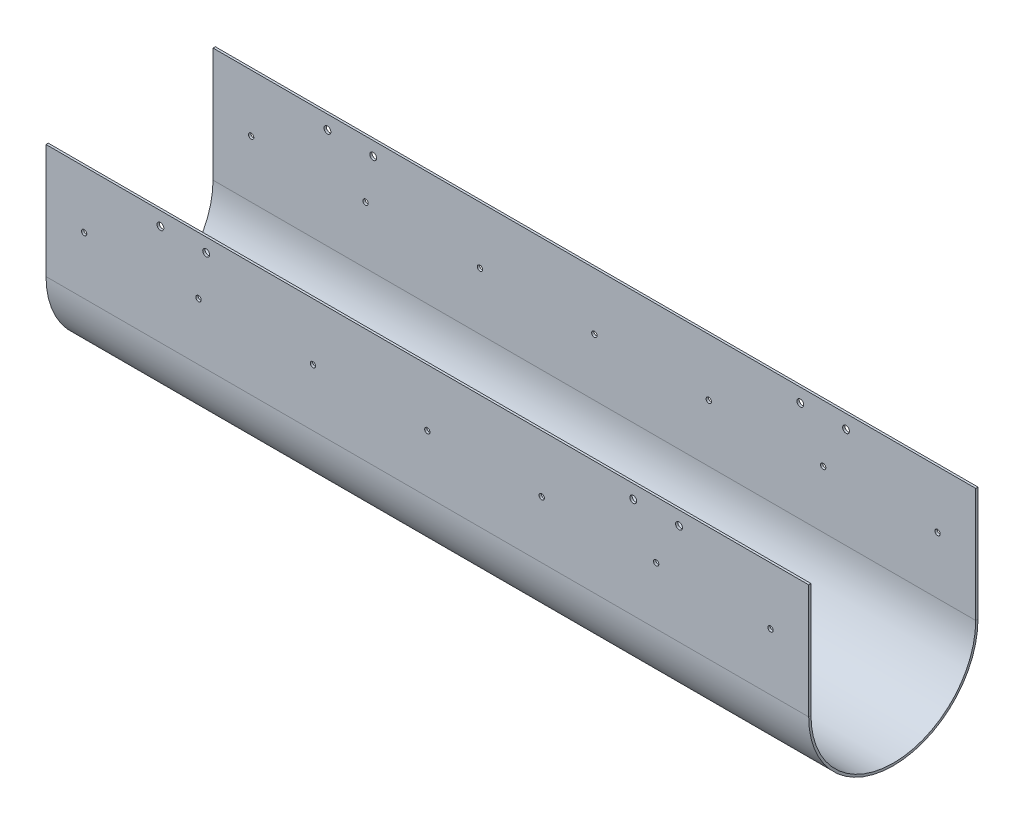
ISO-10303-21;
HEADER;
FILE_DESCRIPTION(('STEP AP214'),'2;1');
FILE_NAME('part.step','',(''),(''),'','','');
FILE_SCHEMA(('AUTOMOTIVE_DESIGN { 1 0 10303 214 1 1 1 1 }'));
ENDSEC;
DATA;
#1=APPLICATION_CONTEXT('core data for automotive mechanical design processes');
#2=APPLICATION_PROTOCOL_DEFINITION('international standard','automotive_design',2000,#1);
#3=PRODUCT_CONTEXT('',#1,'mechanical');
#4=PRODUCT('Part','Part','',(#3));
#5=PRODUCT_RELATED_PRODUCT_CATEGORY('part','',(#4));
#6=PRODUCT_DEFINITION_FORMATION('','',#4);
#7=PRODUCT_DEFINITION_CONTEXT('part definition',#1,'design');
#8=PRODUCT_DEFINITION('design','',#6,#7);
#9=PRODUCT_DEFINITION_SHAPE('','',#8);
#10=(LENGTH_UNIT() NAMED_UNIT(*) SI_UNIT(.MILLI.,.METRE.));
#11=(NAMED_UNIT(*) PLANE_ANGLE_UNIT() SI_UNIT($,.RADIAN.));
#12=(NAMED_UNIT(*) SI_UNIT($,.STERADIAN.) SOLID_ANGLE_UNIT());
#13=UNCERTAINTY_MEASURE_WITH_UNIT(LENGTH_MEASURE(1.E-05),#10,'distance_accuracy_value','');
#14=(GEOMETRIC_REPRESENTATION_CONTEXT(3) GLOBAL_UNCERTAINTY_ASSIGNED_CONTEXT((#13)) GLOBAL_UNIT_ASSIGNED_CONTEXT((#10,
#11,#12)) REPRESENTATION_CONTEXT('',''));
#15=CARTESIAN_POINT('',(0.,0.,0.));
#16=DIRECTION('',(0.,0.,1.));
#17=DIRECTION('',(1.,0.,0.));
#18=AXIS2_PLACEMENT_3D('',#15,#16,#17);
#19=CARTESIAN_POINT('',(500.,0.,108.));
#20=DIRECTION('',(-1.,0.,0.));
#21=DIRECTION('',(0.,1.,0.));
#22=AXIS2_PLACEMENT_3D('',#19,#20,#21);
#23=PLANE('',#22);
#24=DIRECTION('',(0.,0.,-1.));
#25=VECTOR('',#24,1.);
#26=CARTESIAN_POINT('',(500.,150.,108.));
#27=LINE('',#26,#25);
#28=CARTESIAN_POINT('',(500.,150.,111.));
#29=VERTEX_POINT('',#28);
#30=CARTESIAN_POINT('',(500.,150.,108.));
#31=VERTEX_POINT('',#30);
#32=EDGE_CURVE('E12',#29,#31,#27,.T.);
#33=ORIENTED_EDGE('',*,*,#32,.F.);
#34=DIRECTION('',(0.,1.,0.));
#35=VECTOR('',#34,1.);
#36=CARTESIAN_POINT('',(500.,0.,111.));
#37=LINE('',#36,#35);
#38=CARTESIAN_POINT('',(500.,0.,111.));
#39=VERTEX_POINT('',#38);
#40=EDGE_CURVE('E116',#39,#29,#37,.T.);
#41=ORIENTED_EDGE('',*,*,#40,.F.);
#42=DIRECTION('',(0.,0.,-1.));
#43=VECTOR('',#42,1.);
#44=CARTESIAN_POINT('',(500.,0.,108.));
#45=LINE('',#44,#43);
#46=CARTESIAN_POINT('',(500.,0.,108.));
#47=VERTEX_POINT('',#46);
#48=EDGE_CURVE('E56',#39,#47,#45,.T.);
#49=ORIENTED_EDGE('',*,*,#48,.T.);
#50=DIRECTION('',(0.,1.,0.));
#51=VECTOR('',#50,1.);
#52=CARTESIAN_POINT('',(500.,0.,108.));
#53=LINE('',#52,#51);
#54=EDGE_CURVE('E157',#47,#31,#53,.T.);
#55=ORIENTED_EDGE('',*,*,#54,.T.);
#56=EDGE_LOOP('',(#33,#41,#49,#55));
#57=FACE_BOUND('',#56,.T.);
#58=ADVANCED_FACE('F46',(#57),#23,.F.);
#59=CARTESIAN_POINT('',(500.,0.,0.));
#60=DIRECTION('',(-1.,0.,0.));
#61=DIRECTION('',(0.,0.,1.));
#62=AXIS2_PLACEMENT_3D('',#59,#60,#61);
#63=PLANE('',#62);
#64=ORIENTED_EDGE('',*,*,#48,.F.);
#65=CARTESIAN_POINT('',(500.,0.,0.));
#66=DIRECTION('',(1.,0.,0.));
#67=DIRECTION('',(0.,0.,-1.));
#68=AXIS2_PLACEMENT_3D('',#65,#66,#67);
#69=CIRCLE('',#68,111.);
#70=CARTESIAN_POINT('',(500.,0.,-111.));
#71=VERTEX_POINT('',#70);
#72=EDGE_CURVE('E132',#39,#71,#69,.T.);
#73=ORIENTED_EDGE('',*,*,#72,.T.);
#74=DIRECTION('',(0.,0.,1.));
#75=VECTOR('',#74,1.);
#76=CARTESIAN_POINT('',(500.,0.,-108.));
#77=LINE('',#76,#75);
#78=CARTESIAN_POINT('',(500.,0.,-108.));
#79=VERTEX_POINT('',#78);
#80=EDGE_CURVE('E151',#71,#79,#77,.T.);
#81=ORIENTED_EDGE('',*,*,#80,.T.);
#82=CARTESIAN_POINT('',(500.,0.,0.));
#83=DIRECTION('',(1.,0.,0.));
#84=DIRECTION('',(0.,0.,-1.));
#85=AXIS2_PLACEMENT_3D('',#82,#83,#84);
#86=CIRCLE('',#85,108.);
#87=EDGE_CURVE('E169',#47,#79,#86,.T.);
#88=ORIENTED_EDGE('',*,*,#87,.F.);
#89=EDGE_LOOP('',(#64,#73,#81,#88));
#90=FACE_BOUND('',#89,.T.);
#91=ADVANCED_FACE('F170',(#90),#63,.F.);
#92=CARTESIAN_POINT('',(500.,150.,-108.));
#93=DIRECTION('',(-1.,0.,0.));
#94=DIRECTION('',(0.,-1.,0.));
#95=AXIS2_PLACEMENT_3D('',#92,#93,#94);
#96=PLANE('',#95);
#97=ORIENTED_EDGE('',*,*,#80,.F.);
#98=DIRECTION('',(0.,-1.,0.));
#99=VECTOR('',#98,1.);
#100=CARTESIAN_POINT('',(500.,0.,-111.));
#101=LINE('',#100,#99);
#102=CARTESIAN_POINT('',(500.,150.,-111.));
#103=VERTEX_POINT('',#102);
#104=EDGE_CURVE('E136',#103,#71,#101,.T.);
#105=ORIENTED_EDGE('',*,*,#104,.F.);
#106=DIRECTION('',(0.,0.,1.));
#107=VECTOR('',#106,1.);
#108=CARTESIAN_POINT('',(500.,150.,-108.));
#109=LINE('',#108,#107);
#110=CARTESIAN_POINT('',(500.,150.,-108.));
#111=VERTEX_POINT('',#110);
#112=EDGE_CURVE('E149',#103,#111,#109,.T.);
#113=ORIENTED_EDGE('',*,*,#112,.T.);
#114=DIRECTION('',(0.,-1.,0.));
#115=VECTOR('',#114,1.);
#116=CARTESIAN_POINT('',(500.,150.,-108.));
#117=LINE('',#116,#115);
#118=EDGE_CURVE('E109',#111,#79,#117,.T.);
#119=ORIENTED_EDGE('',*,*,#118,.T.);
#120=EDGE_LOOP('',(#97,#105,#113,#119));
#121=FACE_BOUND('',#120,.T.);
#122=ADVANCED_FACE('F228',(#121),#96,.F.);
#123=CARTESIAN_POINT('',(500.,150.,-108.));
#124=DIRECTION('',(0.,1.,0.));
#125=DIRECTION('',(-1.,0.,0.));
#126=AXIS2_PLACEMENT_3D('',#123,#124,#125);
#127=PLANE('',#126);
#128=ORIENTED_EDGE('',*,*,#112,.F.);
#129=DIRECTION('',(1.,0.,0.));
#130=VECTOR('',#129,1.);
#131=CARTESIAN_POINT('',(0.,150.,-111.));
#132=LINE('',#131,#130);
#133=CARTESIAN_POINT('',(-500.,150.,-111.));
#134=VERTEX_POINT('',#133);
#135=EDGE_CURVE('E131',#103,#134,#132,.F.);
#136=ORIENTED_EDGE('',*,*,#135,.T.);
#137=DIRECTION('',(0.,0.,1.));
#138=VECTOR('',#137,1.);
#139=CARTESIAN_POINT('',(-500.,150.,-108.));
#140=LINE('',#139,#138);
#141=CARTESIAN_POINT('',(-500.,150.,-108.));
#142=VERTEX_POINT('',#141);
#143=EDGE_CURVE('E64',#134,#142,#140,.T.);
#144=ORIENTED_EDGE('',*,*,#143,.T.);
#145=DIRECTION('',(-1.,0.,0.));
#146=VECTOR('',#145,1.);
#147=CARTESIAN_POINT('',(500.,150.,-108.));
#148=LINE('',#147,#146);
#149=EDGE_CURVE('E186',#111,#142,#148,.T.);
#150=ORIENTED_EDGE('',*,*,#149,.F.);
#151=EDGE_LOOP('',(#128,#136,#144,#150));
#152=FACE_BOUND('',#151,.T.);
#153=ADVANCED_FACE('F233',(#152),#127,.T.);
#154=CARTESIAN_POINT('',(-500.,150.,-108.));
#155=DIRECTION('',(-1.,0.,0.));
#156=DIRECTION('',(0.,-1.,0.));
#157=AXIS2_PLACEMENT_3D('',#154,#155,#156);
#158=PLANE('',#157);
#159=ORIENTED_EDGE('',*,*,#143,.F.);
#160=DIRECTION('',(0.,-1.,0.));
#161=VECTOR('',#160,1.);
#162=CARTESIAN_POINT('',(-500.,0.,-111.));
#163=LINE('',#162,#161);
#164=CARTESIAN_POINT('',(-500.,0.,-111.));
#165=VERTEX_POINT('',#164);
#166=EDGE_CURVE('E133',#134,#165,#163,.T.);
#167=ORIENTED_EDGE('',*,*,#166,.T.);
#168=DIRECTION('',(0.,0.,1.));
#169=VECTOR('',#168,1.);
#170=CARTESIAN_POINT('',(-500.,0.,-108.));
#171=LINE('',#170,#169);
#172=CARTESIAN_POINT('',(-500.,0.,-108.));
#173=VERTEX_POINT('',#172);
#174=EDGE_CURVE('E145',#165,#173,#171,.T.);
#175=ORIENTED_EDGE('',*,*,#174,.T.);
#176=DIRECTION('',(0.,-1.,0.));
#177=VECTOR('',#176,1.);
#178=CARTESIAN_POINT('',(-500.,150.,-108.));
#179=LINE('',#178,#177);
#180=EDGE_CURVE('E189',#142,#173,#179,.T.);
#181=ORIENTED_EDGE('',*,*,#180,.F.);
#182=EDGE_LOOP('',(#159,#167,#175,#181));
#183=FACE_BOUND('',#182,.T.);
#184=ADVANCED_FACE('F198',(#183),#158,.T.);
#185=CARTESIAN_POINT('',(-500.,0.,0.));
#186=DIRECTION('',(-1.,0.,0.));
#187=DIRECTION('',(0.,0.,1.));
#188=AXIS2_PLACEMENT_3D('',#185,#186,#187);
#189=PLANE('',#188);
#190=ORIENTED_EDGE('',*,*,#174,.F.);
#191=CARTESIAN_POINT('',(-500.,0.,0.));
#192=DIRECTION('',(1.,0.,0.));
#193=DIRECTION('',(0.,0.,-1.));
#194=AXIS2_PLACEMENT_3D('',#191,#192,#193);
#195=CIRCLE('',#194,111.);
#196=CARTESIAN_POINT('',(-500.,0.,111.));
#197=VERTEX_POINT('',#196);
#198=EDGE_CURVE('E128',#197,#165,#195,.T.);
#199=ORIENTED_EDGE('',*,*,#198,.F.);
#200=DIRECTION('',(0.,0.,-1.));
#201=VECTOR('',#200,1.);
#202=CARTESIAN_POINT('',(-500.,0.,108.));
#203=LINE('',#202,#201);
#204=CARTESIAN_POINT('',(-500.,0.,108.));
#205=VERTEX_POINT('',#204);
#206=EDGE_CURVE('E108',#197,#205,#203,.T.);
#207=ORIENTED_EDGE('',*,*,#206,.T.);
#208=CARTESIAN_POINT('',(-500.,0.,0.));
#209=DIRECTION('',(1.,0.,0.));
#210=DIRECTION('',(0.,0.,-1.));
#211=AXIS2_PLACEMENT_3D('',#208,#209,#210);
#212=CIRCLE('',#211,108.);
#213=EDGE_CURVE('E175',#205,#173,#212,.T.);
#214=ORIENTED_EDGE('',*,*,#213,.T.);
#215=EDGE_LOOP('',(#190,#199,#207,#214));
#216=FACE_BOUND('',#215,.T.);
#217=ADVANCED_FACE('F202',(#216),#189,.T.);
#218=CARTESIAN_POINT('',(-500.,0.,108.));
#219=DIRECTION('',(-1.,0.,0.));
#220=DIRECTION('',(0.,1.,0.));
#221=AXIS2_PLACEMENT_3D('',#218,#219,#220);
#222=PLANE('',#221);
#223=ORIENTED_EDGE('',*,*,#206,.F.);
#224=DIRECTION('',(0.,1.,0.));
#225=VECTOR('',#224,1.);
#226=CARTESIAN_POINT('',(-500.,0.,111.));
#227=LINE('',#226,#225);
#228=CARTESIAN_POINT('',(-500.,150.,111.));
#229=VERTEX_POINT('',#228);
#230=EDGE_CURVE('E114',#197,#229,#227,.T.);
#231=ORIENTED_EDGE('',*,*,#230,.T.);
#232=DIRECTION('',(0.,0.,-1.));
#233=VECTOR('',#232,1.);
#234=CARTESIAN_POINT('',(-500.,150.,108.));
#235=LINE('',#234,#233);
#236=CARTESIAN_POINT('',(-500.,150.,108.));
#237=VERTEX_POINT('',#236);
#238=EDGE_CURVE('E50',#229,#237,#235,.T.);
#239=ORIENTED_EDGE('',*,*,#238,.T.);
#240=DIRECTION('',(0.,1.,0.));
#241=VECTOR('',#240,1.);
#242=CARTESIAN_POINT('',(-500.,0.,108.));
#243=LINE('',#242,#241);
#244=EDGE_CURVE('E180',#205,#237,#243,.T.);
#245=ORIENTED_EDGE('',*,*,#244,.F.);
#246=EDGE_LOOP('',(#223,#231,#239,#245));
#247=FACE_BOUND('',#246,.T.);
#248=ADVANCED_FACE('F118',(#247),#222,.T.);
#249=CARTESIAN_POINT('',(500.,150.,108.));
#250=DIRECTION('',(0.,-1.,0.));
#251=DIRECTION('',(-1.,0.,0.));
#252=AXIS2_PLACEMENT_3D('',#249,#250,#251);
#253=PLANE('',#252);
#254=DIRECTION('',(-1.,0.,0.));
#255=VECTOR('',#254,1.);
#256=CARTESIAN_POINT('',(0.,150.,111.));
#257=LINE('',#256,#255);
#258=EDGE_CURVE('E100',#29,#229,#257,.T.);
#259=ORIENTED_EDGE('',*,*,#258,.F.);
#260=ORIENTED_EDGE('',*,*,#32,.T.);
#261=DIRECTION('',(-1.,0.,0.));
#262=VECTOR('',#261,1.);
#263=CARTESIAN_POINT('',(500.,150.,108.));
#264=LINE('',#263,#262);
#265=EDGE_CURVE('E103',#31,#237,#264,.T.);
#266=ORIENTED_EDGE('',*,*,#265,.T.);
#267=ORIENTED_EDGE('',*,*,#238,.F.);
#268=EDGE_LOOP('',(#259,#260,#266,#267));
#269=FACE_BOUND('',#268,.T.);
#270=ADVANCED_FACE('F48',(#269),#253,.F.);
#271=CARTESIAN_POINT('',(0.,0.,108.));
#272=DIRECTION('',(0.,0.,-1.));
#273=DIRECTION('',(-1.,0.,0.));
#274=AXIS2_PLACEMENT_3D('',#271,#272,#273);
#275=PLANE('',#274);
#276=CARTESIAN_POINT('',(450.,74.9999999999999,108.));
#277=DIRECTION('',(0.,0.,-1.));
#278=DIRECTION('',(-1.,0.,0.));
#279=AXIS2_PLACEMENT_3D('',#276,#277,#278);
#280=CIRCLE('',#279,3.50000000000002);
#281=CARTESIAN_POINT('',(446.5,74.9999999999999,108.));
#282=VERTEX_POINT('',#281);
#283=EDGE_CURVE('E123',#282,#282,#280,.T.);
#284=ORIENTED_EDGE('',*,*,#283,.F.);
#285=EDGE_LOOP('',(#284));
#286=FACE_BOUND('',#285,.T.);
#287=CARTESIAN_POINT('',(-290.,132.,108.));
#288=DIRECTION('',(0.,0.,-1.));
#289=DIRECTION('',(-1.,0.,0.));
#290=AXIS2_PLACEMENT_3D('',#287,#288,#289);
#291=CIRCLE('',#290,4.50000000000002);
#292=CARTESIAN_POINT('',(-294.5,132.,108.));
#293=VERTEX_POINT('',#292);
#294=EDGE_CURVE('E351',#293,#293,#291,.T.);
#295=ORIENTED_EDGE('',*,*,#294,.F.);
#296=EDGE_LOOP('',(#295));
#297=FACE_BOUND('',#296,.T.);
#298=CARTESIAN_POINT('',(-350.,132.,108.));
#299=DIRECTION('',(0.,0.,-1.));
#300=DIRECTION('',(-1.,0.,0.));
#301=AXIS2_PLACEMENT_3D('',#298,#299,#300);
#302=CIRCLE('',#301,4.50000000000002);
#303=CARTESIAN_POINT('',(-354.5,132.,108.));
#304=VERTEX_POINT('',#303);
#305=EDGE_CURVE('E347',#304,#304,#302,.T.);
#306=ORIENTED_EDGE('',*,*,#305,.F.);
#307=EDGE_LOOP('',(#306));
#308=FACE_BOUND('',#307,.T.);
#309=CARTESIAN_POINT('',(330.,132.,108.));
#310=DIRECTION('',(0.,0.,-1.));
#311=DIRECTION('',(-1.,0.,0.));
#312=AXIS2_PLACEMENT_3D('',#309,#310,#311);
#313=CIRCLE('',#312,4.50000000000002);
#314=CARTESIAN_POINT('',(325.5,132.,108.));
#315=VERTEX_POINT('',#314);
#316=EDGE_CURVE('E343',#315,#315,#313,.T.);
#317=ORIENTED_EDGE('',*,*,#316,.F.);
#318=EDGE_LOOP('',(#317));
#319=FACE_BOUND('',#318,.T.);
#320=CARTESIAN_POINT('',(300.,74.9999999999999,108.));
#321=DIRECTION('',(0.,0.,-1.));
#322=DIRECTION('',(-1.,0.,0.));
#323=AXIS2_PLACEMENT_3D('',#320,#321,#322);
#324=CIRCLE('',#323,3.50000000000002);
#325=CARTESIAN_POINT('',(296.5,74.9999999999999,108.));
#326=VERTEX_POINT('',#325);
#327=EDGE_CURVE('E339',#326,#326,#324,.T.);
#328=ORIENTED_EDGE('',*,*,#327,.F.);
#329=EDGE_LOOP('',(#328));
#330=FACE_BOUND('',#329,.T.);
#331=CARTESIAN_POINT('',(150.,74.9999999999999,108.));
#332=DIRECTION('',(0.,0.,-1.));
#333=DIRECTION('',(-1.,0.,0.));
#334=AXIS2_PLACEMENT_3D('',#331,#332,#333);
#335=CIRCLE('',#334,3.49999999999999);
#336=CARTESIAN_POINT('',(146.5,74.9999999999999,108.));
#337=VERTEX_POINT('',#336);
#338=EDGE_CURVE('E335',#337,#337,#335,.T.);
#339=ORIENTED_EDGE('',*,*,#338,.F.);
#340=EDGE_LOOP('',(#339));
#341=FACE_BOUND('',#340,.T.);
#342=CARTESIAN_POINT('',(0.,74.9999999999999,108.));
#343=DIRECTION('',(0.,0.,-1.));
#344=DIRECTION('',(-1.,0.,0.));
#345=AXIS2_PLACEMENT_3D('',#342,#343,#344);
#346=CIRCLE('',#345,3.5);
#347=CARTESIAN_POINT('',(-3.49999999999995,74.9999999999999,108.));
#348=VERTEX_POINT('',#347);
#349=EDGE_CURVE('E331',#348,#348,#346,.T.);
#350=ORIENTED_EDGE('',*,*,#349,.F.);
#351=EDGE_LOOP('',(#350));
#352=FACE_BOUND('',#351,.T.);
#353=CARTESIAN_POINT('',(270.,132.,108.));
#354=DIRECTION('',(0.,0.,-1.));
#355=DIRECTION('',(-1.,0.,0.));
#356=AXIS2_PLACEMENT_3D('',#353,#354,#355);
#357=CIRCLE('',#356,4.50000000000002);
#358=CARTESIAN_POINT('',(265.5,132.,108.));
#359=VERTEX_POINT('',#358);
#360=EDGE_CURVE('E327',#359,#359,#357,.T.);
#361=ORIENTED_EDGE('',*,*,#360,.F.);
#362=EDGE_LOOP('',(#361));
#363=FACE_BOUND('',#362,.T.);
#364=CARTESIAN_POINT('',(-450.,74.9999999999998,108.));
#365=DIRECTION('',(0.,0.,-1.));
#366=DIRECTION('',(-1.,0.,0.));
#367=AXIS2_PLACEMENT_3D('',#364,#365,#366);
#368=CIRCLE('',#367,3.50000000000002);
#369=CARTESIAN_POINT('',(-453.5,74.9999999999998,108.));
#370=VERTEX_POINT('',#369);
#371=EDGE_CURVE('E323',#370,#370,#368,.T.);
#372=ORIENTED_EDGE('',*,*,#371,.F.);
#373=EDGE_LOOP('',(#372));
#374=FACE_BOUND('',#373,.T.);
#375=CARTESIAN_POINT('',(-300.,74.9999999999999,108.));
#376=DIRECTION('',(0.,0.,-1.));
#377=DIRECTION('',(-1.,0.,0.));
#378=AXIS2_PLACEMENT_3D('',#375,#376,#377);
#379=CIRCLE('',#378,3.50000000000002);
#380=CARTESIAN_POINT('',(-303.5,74.9999999999999,108.));
#381=VERTEX_POINT('',#380);
#382=EDGE_CURVE('E319',#381,#381,#379,.T.);
#383=ORIENTED_EDGE('',*,*,#382,.F.);
#384=EDGE_LOOP('',(#383));
#385=FACE_BOUND('',#384,.T.);
#386=CARTESIAN_POINT('',(-150.,74.9999999999999,108.));
#387=DIRECTION('',(0.,0.,-1.));
#388=DIRECTION('',(-1.,0.,0.));
#389=AXIS2_PLACEMENT_3D('',#386,#387,#388);
#390=CIRCLE('',#389,3.49999999999999);
#391=CARTESIAN_POINT('',(-153.5,74.9999999999999,108.));
#392=VERTEX_POINT('',#391);
#393=EDGE_CURVE('E306',#392,#392,#390,.T.);
#394=ORIENTED_EDGE('',*,*,#393,.F.);
#395=EDGE_LOOP('',(#394));
#396=FACE_BOUND('',#395,.T.);
#397=DIRECTION('',(-1.,0.,0.));
#398=VECTOR('',#397,1.);
#399=CARTESIAN_POINT('',(500.,0.,108.));
#400=LINE('',#399,#398);
#401=EDGE_CURVE('E140',#47,#205,#400,.T.);
#402=ORIENTED_EDGE('',*,*,#401,.T.);
#403=ORIENTED_EDGE('',*,*,#244,.T.);
#404=ORIENTED_EDGE('',*,*,#265,.F.);
#405=ORIENTED_EDGE('',*,*,#54,.F.);
#406=EDGE_LOOP('',(#402,#403,#404,#405));
#407=FACE_BOUND('',#406,.T.);
#408=ADVANCED_FACE('F163',(#286,#297,#308,#319,#330,#341,#352,#363,#374,#385,#396,#407),#275,.T.);
#409=CARTESIAN_POINT('',(500.,0.,0.));
#410=DIRECTION('',(1.,0.,0.));
#411=DIRECTION('',(0.,0.,-1.));
#412=AXIS2_PLACEMENT_3D('',#409,#410,#411);
#413=CYLINDRICAL_SURFACE('',#412,108.);
#414=DIRECTION('',(-1.,0.,0.));
#415=VECTOR('',#414,1.);
#416=CARTESIAN_POINT('',(500.,0.,-108.));
#417=LINE('',#416,#415);
#418=EDGE_CURVE('E166',#79,#173,#417,.T.);
#419=ORIENTED_EDGE('',*,*,#418,.T.);
#420=ORIENTED_EDGE('',*,*,#213,.F.);
#421=ORIENTED_EDGE('',*,*,#401,.F.);
#422=ORIENTED_EDGE('',*,*,#87,.T.);
#423=EDGE_LOOP('',(#419,#420,#421,#422));
#424=FACE_BOUND('',#423,.T.);
#425=ADVANCED_FACE('F178',(#424),#413,.F.);
#426=CARTESIAN_POINT('',(0.,0.,-108.));
#427=DIRECTION('',(0.,0.,1.));
#428=DIRECTION('',(0.,-1.,0.));
#429=AXIS2_PLACEMENT_3D('',#426,#427,#428);
#430=PLANE('',#429);
#431=CARTESIAN_POINT('',(450.,74.9999999999999,-108.));
#432=DIRECTION('',(0.,0.,1.));
#433=DIRECTION('',(0.,-1.,0.));
#434=AXIS2_PLACEMENT_3D('',#431,#432,#433);
#435=CIRCLE('',#434,3.50000000000002);
#436=CARTESIAN_POINT('',(450.,71.4999999999999,-108.));
#437=VERTEX_POINT('',#436);
#438=EDGE_CURVE('E265',#437,#437,#435,.T.);
#439=ORIENTED_EDGE('',*,*,#438,.F.);
#440=EDGE_LOOP('',(#439));
#441=FACE_BOUND('',#440,.T.);
#442=CARTESIAN_POINT('',(-290.,132.,-108.));
#443=DIRECTION('',(0.,0.,1.));
#444=DIRECTION('',(0.,-1.,0.));
#445=AXIS2_PLACEMENT_3D('',#442,#443,#444);
#446=CIRCLE('',#445,4.50000000000002);
#447=CARTESIAN_POINT('',(-290.,127.5,-108.));
#448=VERTEX_POINT('',#447);
#449=EDGE_CURVE('E269',#448,#448,#446,.T.);
#450=ORIENTED_EDGE('',*,*,#449,.F.);
#451=EDGE_LOOP('',(#450));
#452=FACE_BOUND('',#451,.T.);
#453=CARTESIAN_POINT('',(-350.,132.,-108.));
#454=DIRECTION('',(0.,0.,1.));
#455=DIRECTION('',(0.,-1.,0.));
#456=AXIS2_PLACEMENT_3D('',#453,#454,#455);
#457=CIRCLE('',#456,4.50000000000002);
#458=CARTESIAN_POINT('',(-350.,127.5,-108.));
#459=VERTEX_POINT('',#458);
#460=EDGE_CURVE('E273',#459,#459,#457,.T.);
#461=ORIENTED_EDGE('',*,*,#460,.F.);
#462=EDGE_LOOP('',(#461));
#463=FACE_BOUND('',#462,.T.);
#464=CARTESIAN_POINT('',(330.,132.,-108.));
#465=DIRECTION('',(0.,0.,1.));
#466=DIRECTION('',(0.,-1.,0.));
#467=AXIS2_PLACEMENT_3D('',#464,#465,#466);
#468=CIRCLE('',#467,4.50000000000002);
#469=CARTESIAN_POINT('',(330.,127.5,-108.));
#470=VERTEX_POINT('',#469);
#471=EDGE_CURVE('E277',#470,#470,#468,.T.);
#472=ORIENTED_EDGE('',*,*,#471,.F.);
#473=EDGE_LOOP('',(#472));
#474=FACE_BOUND('',#473,.T.);
#475=CARTESIAN_POINT('',(300.,74.9999999999999,-108.));
#476=DIRECTION('',(0.,0.,1.));
#477=DIRECTION('',(0.,-1.,0.));
#478=AXIS2_PLACEMENT_3D('',#475,#476,#477);
#479=CIRCLE('',#478,3.50000000000002);
#480=CARTESIAN_POINT('',(300.,71.4999999999999,-108.));
#481=VERTEX_POINT('',#480);
#482=EDGE_CURVE('E281',#481,#481,#479,.T.);
#483=ORIENTED_EDGE('',*,*,#482,.F.);
#484=EDGE_LOOP('',(#483));
#485=FACE_BOUND('',#484,.T.);
#486=CARTESIAN_POINT('',(150.,74.9999999999999,-108.));
#487=DIRECTION('',(0.,0.,1.));
#488=DIRECTION('',(0.,-1.,0.));
#489=AXIS2_PLACEMENT_3D('',#486,#487,#488);
#490=CIRCLE('',#489,3.49999999999999);
#491=CARTESIAN_POINT('',(150.,71.4999999999999,-108.));
#492=VERTEX_POINT('',#491);
#493=EDGE_CURVE('E285',#492,#492,#490,.T.);
#494=ORIENTED_EDGE('',*,*,#493,.F.);
#495=EDGE_LOOP('',(#494));
#496=FACE_BOUND('',#495,.T.);
#497=CARTESIAN_POINT('',(0.,74.9999999999999,-108.));
#498=DIRECTION('',(0.,0.,1.));
#499=DIRECTION('',(0.,-1.,0.));
#500=AXIS2_PLACEMENT_3D('',#497,#498,#499);
#501=CIRCLE('',#500,3.5);
#502=CARTESIAN_POINT('',(0.,71.4999999999999,-108.));
#503=VERTEX_POINT('',#502);
#504=EDGE_CURVE('E289',#503,#503,#501,.T.);
#505=ORIENTED_EDGE('',*,*,#504,.F.);
#506=EDGE_LOOP('',(#505));
#507=FACE_BOUND('',#506,.T.);
#508=CARTESIAN_POINT('',(270.,132.,-108.));
#509=DIRECTION('',(0.,0.,1.));
#510=DIRECTION('',(0.,-1.,0.));
#511=AXIS2_PLACEMENT_3D('',#508,#509,#510);
#512=CIRCLE('',#511,4.50000000000002);
#513=CARTESIAN_POINT('',(270.,127.5,-108.));
#514=VERTEX_POINT('',#513);
#515=EDGE_CURVE('E293',#514,#514,#512,.T.);
#516=ORIENTED_EDGE('',*,*,#515,.F.);
#517=EDGE_LOOP('',(#516));
#518=FACE_BOUND('',#517,.T.);
#519=CARTESIAN_POINT('',(-450.,74.9999999999998,-108.));
#520=DIRECTION('',(0.,0.,1.));
#521=DIRECTION('',(0.,-1.,0.));
#522=AXIS2_PLACEMENT_3D('',#519,#520,#521);
#523=CIRCLE('',#522,3.50000000000002);
#524=CARTESIAN_POINT('',(-450.,71.4999999999998,-108.));
#525=VERTEX_POINT('',#524);
#526=EDGE_CURVE('E297',#525,#525,#523,.T.);
#527=ORIENTED_EDGE('',*,*,#526,.F.);
#528=EDGE_LOOP('',(#527));
#529=FACE_BOUND('',#528,.T.);
#530=CARTESIAN_POINT('',(-300.,74.9999999999999,-108.));
#531=DIRECTION('',(0.,0.,1.));
#532=DIRECTION('',(0.,-1.,0.));
#533=AXIS2_PLACEMENT_3D('',#530,#531,#532);
#534=CIRCLE('',#533,3.50000000000002);
#535=CARTESIAN_POINT('',(-300.,71.4999999999998,-108.));
#536=VERTEX_POINT('',#535);
#537=EDGE_CURVE('E301',#536,#536,#534,.T.);
#538=ORIENTED_EDGE('',*,*,#537,.F.);
#539=EDGE_LOOP('',(#538));
#540=FACE_BOUND('',#539,.T.);
#541=CARTESIAN_POINT('',(-150.,74.9999999999999,-108.));
#542=DIRECTION('',(0.,0.,1.));
#543=DIRECTION('',(0.,-1.,0.));
#544=AXIS2_PLACEMENT_3D('',#541,#542,#543);
#545=CIRCLE('',#544,3.49999999999999);
#546=CARTESIAN_POINT('',(-150.,71.4999999999999,-108.));
#547=VERTEX_POINT('',#546);
#548=EDGE_CURVE('E304',#547,#547,#545,.T.);
#549=ORIENTED_EDGE('',*,*,#548,.F.);
#550=EDGE_LOOP('',(#549));
#551=FACE_BOUND('',#550,.T.);
#552=ORIENTED_EDGE('',*,*,#149,.T.);
#553=ORIENTED_EDGE('',*,*,#180,.T.);
#554=ORIENTED_EDGE('',*,*,#418,.F.);
#555=ORIENTED_EDGE('',*,*,#118,.F.);
#556=EDGE_LOOP('',(#552,#553,#554,#555));
#557=FACE_BOUND('',#556,.T.);
#558=ADVANCED_FACE('F195',(#441,#452,#463,#474,#485,#496,#507,#518,#529,#540,#551,#557),#430,.T.);
#559=CARTESIAN_POINT('',(0.,0.,111.));
#560=DIRECTION('',(0.,0.,-1.));
#561=DIRECTION('',(-1.,0.,0.));
#562=AXIS2_PLACEMENT_3D('',#559,#560,#561);
#563=PLANE('',#562);
#564=CARTESIAN_POINT('',(450.,74.9999999999999,111.));
#565=DIRECTION('',(0.,0.,1.));
#566=DIRECTION('',(1.,0.,0.));
#567=AXIS2_PLACEMENT_3D('',#564,#565,#566);
#568=CIRCLE('',#567,3.50000000000002);
#569=CARTESIAN_POINT('',(453.5,74.9999999999999,111.));
#570=VERTEX_POINT('',#569);
#571=EDGE_CURVE('E312',#570,#570,#568,.T.);
#572=ORIENTED_EDGE('',*,*,#571,.F.);
#573=EDGE_LOOP('',(#572));
#574=FACE_BOUND('',#573,.T.);
#575=CARTESIAN_POINT('',(-290.,132.,111.));
#576=DIRECTION('',(0.,0.,1.));
#577=DIRECTION('',(1.,0.,0.));
#578=AXIS2_PLACEMENT_3D('',#575,#576,#577);
#579=CIRCLE('',#578,4.50000000000002);
#580=CARTESIAN_POINT('',(-285.5,132.,111.));
#581=VERTEX_POINT('',#580);
#582=EDGE_CURVE('E375',#581,#581,#579,.T.);
#583=ORIENTED_EDGE('',*,*,#582,.F.);
#584=EDGE_LOOP('',(#583));
#585=FACE_BOUND('',#584,.T.);
#586=CARTESIAN_POINT('',(-350.,132.,111.));
#587=DIRECTION('',(0.,0.,1.));
#588=DIRECTION('',(1.,0.,0.));
#589=AXIS2_PLACEMENT_3D('',#586,#587,#588);
#590=CIRCLE('',#589,4.50000000000002);
#591=CARTESIAN_POINT('',(-345.5,132.,111.));
#592=VERTEX_POINT('',#591);
#593=EDGE_CURVE('E374',#592,#592,#590,.T.);
#594=ORIENTED_EDGE('',*,*,#593,.F.);
#595=EDGE_LOOP('',(#594));
#596=FACE_BOUND('',#595,.T.);
#597=CARTESIAN_POINT('',(330.,132.,111.));
#598=DIRECTION('',(0.,0.,1.));
#599=DIRECTION('',(1.,0.,0.));
#600=AXIS2_PLACEMENT_3D('',#597,#598,#599);
#601=CIRCLE('',#600,4.50000000000002);
#602=CARTESIAN_POINT('',(334.5,132.,111.));
#603=VERTEX_POINT('',#602);
#604=EDGE_CURVE('E365',#603,#603,#601,.T.);
#605=ORIENTED_EDGE('',*,*,#604,.F.);
#606=EDGE_LOOP('',(#605));
#607=FACE_BOUND('',#606,.T.);
#608=CARTESIAN_POINT('',(300.,74.9999999999999,111.));
#609=DIRECTION('',(0.,0.,1.));
#610=DIRECTION('',(1.,0.,0.));
#611=AXIS2_PLACEMENT_3D('',#608,#609,#610);
#612=CIRCLE('',#611,3.50000000000002);
#613=CARTESIAN_POINT('',(303.5,74.9999999999999,111.));
#614=VERTEX_POINT('',#613);
#615=EDGE_CURVE('E409',#614,#614,#612,.T.);
#616=ORIENTED_EDGE('',*,*,#615,.F.);
#617=EDGE_LOOP('',(#616));
#618=FACE_BOUND('',#617,.T.);
#619=CARTESIAN_POINT('',(150.,74.9999999999999,111.));
#620=DIRECTION('',(0.,0.,1.));
#621=DIRECTION('',(1.,0.,0.));
#622=AXIS2_PLACEMENT_3D('',#619,#620,#621);
#623=CIRCLE('',#622,3.49999999999999);
#624=CARTESIAN_POINT('',(153.5,74.9999999999999,111.));
#625=VERTEX_POINT('',#624);
#626=EDGE_CURVE('E414',#625,#625,#623,.T.);
#627=ORIENTED_EDGE('',*,*,#626,.F.);
#628=EDGE_LOOP('',(#627));
#629=FACE_BOUND('',#628,.T.);
#630=CARTESIAN_POINT('',(0.,74.9999999999999,111.));
#631=DIRECTION('',(0.,0.,1.));
#632=DIRECTION('',(1.,0.,0.));
#633=AXIS2_PLACEMENT_3D('',#630,#631,#632);
#634=CIRCLE('',#633,3.5);
#635=CARTESIAN_POINT('',(3.50000000000006,74.9999999999999,111.));
#636=VERTEX_POINT('',#635);
#637=EDGE_CURVE('E315',#636,#636,#634,.T.);
#638=ORIENTED_EDGE('',*,*,#637,.F.);
#639=EDGE_LOOP('',(#638));
#640=FACE_BOUND('',#639,.T.);
#641=CARTESIAN_POINT('',(270.,132.,111.));
#642=DIRECTION('',(0.,0.,1.));
#643=DIRECTION('',(1.,0.,0.));
#644=AXIS2_PLACEMENT_3D('',#641,#642,#643);
#645=CIRCLE('',#644,4.50000000000002);
#646=CARTESIAN_POINT('',(274.5,132.,111.));
#647=VERTEX_POINT('',#646);
#648=EDGE_CURVE('E388',#647,#647,#645,.T.);
#649=ORIENTED_EDGE('',*,*,#648,.F.);
#650=EDGE_LOOP('',(#649));
#651=FACE_BOUND('',#650,.T.);
#652=CARTESIAN_POINT('',(-450.,74.9999999999998,111.));
#653=DIRECTION('',(0.,0.,1.));
#654=DIRECTION('',(1.,0.,0.));
#655=AXIS2_PLACEMENT_3D('',#652,#653,#654);
#656=CIRCLE('',#655,3.50000000000002);
#657=CARTESIAN_POINT('',(-446.5,74.9999999999998,111.));
#658=VERTEX_POINT('',#657);
#659=EDGE_CURVE('E387',#658,#658,#656,.T.);
#660=ORIENTED_EDGE('',*,*,#659,.F.);
#661=EDGE_LOOP('',(#660));
#662=FACE_BOUND('',#661,.T.);
#663=CARTESIAN_POINT('',(-300.,74.9999999999999,111.));
#664=DIRECTION('',(0.,0.,1.));
#665=DIRECTION('',(1.,0.,0.));
#666=AXIS2_PLACEMENT_3D('',#663,#664,#665);
#667=CIRCLE('',#666,3.50000000000002);
#668=CARTESIAN_POINT('',(-296.5,74.9999999999999,111.));
#669=VERTEX_POINT('',#668);
#670=EDGE_CURVE('E400',#669,#669,#667,.T.);
#671=ORIENTED_EDGE('',*,*,#670,.F.);
#672=EDGE_LOOP('',(#671));
#673=FACE_BOUND('',#672,.T.);
#674=CARTESIAN_POINT('',(-150.,74.9999999999999,111.));
#675=DIRECTION('',(0.,0.,1.));
#676=DIRECTION('',(1.,0.,0.));
#677=AXIS2_PLACEMENT_3D('',#674,#675,#676);
#678=CIRCLE('',#677,3.49999999999999);
#679=CARTESIAN_POINT('',(-146.5,74.9999999999999,111.));
#680=VERTEX_POINT('',#679);
#681=EDGE_CURVE('E399',#680,#680,#678,.T.);
#682=ORIENTED_EDGE('',*,*,#681,.F.);
#683=EDGE_LOOP('',(#682));
#684=FACE_BOUND('',#683,.T.);
#685=DIRECTION('',(-1.,0.,0.));
#686=VECTOR('',#685,1.);
#687=CARTESIAN_POINT('',(0.,0.,111.));
#688=LINE('',#687,#686);
#689=EDGE_CURVE('E121',#39,#197,#688,.T.);
#690=ORIENTED_EDGE('',*,*,#689,.F.);
#691=ORIENTED_EDGE('',*,*,#40,.T.);
#692=ORIENTED_EDGE('',*,*,#258,.T.);
#693=ORIENTED_EDGE('',*,*,#230,.F.);
#694=EDGE_LOOP('',(#690,#691,#692,#693));
#695=FACE_BOUND('',#694,.T.);
#696=ADVANCED_FACE('F113',(#574,#585,#596,#607,#618,#629,#640,#651,#662,#673,#684,#695),#563,.F.);
#697=CARTESIAN_POINT('',(500.,0.,0.));
#698=DIRECTION('',(1.,0.,0.));
#699=DIRECTION('',(0.,0.,-1.));
#700=AXIS2_PLACEMENT_3D('',#697,#698,#699);
#701=CYLINDRICAL_SURFACE('',#700,111.);
#702=DIRECTION('',(1.,0.,0.));
#703=VECTOR('',#702,1.);
#704=CARTESIAN_POINT('',(500.,0.,-111.));
#705=LINE('',#704,#703);
#706=EDGE_CURVE('E127',#71,#165,#705,.F.);
#707=ORIENTED_EDGE('',*,*,#706,.F.);
#708=ORIENTED_EDGE('',*,*,#72,.F.);
#709=ORIENTED_EDGE('',*,*,#689,.T.);
#710=ORIENTED_EDGE('',*,*,#198,.T.);
#711=EDGE_LOOP('',(#707,#708,#709,#710));
#712=FACE_BOUND('',#711,.T.);
#713=ADVANCED_FACE('F210',(#712),#701,.T.);
#714=CARTESIAN_POINT('',(0.,0.,-111.));
#715=DIRECTION('',(0.,0.,1.));
#716=DIRECTION('',(0.,-1.,0.));
#717=AXIS2_PLACEMENT_3D('',#714,#715,#716);
#718=PLANE('',#717);
#719=CARTESIAN_POINT('',(450.,74.9999999999999,-111.));
#720=DIRECTION('',(0.,0.,1.));
#721=DIRECTION('',(1.,0.,0.));
#722=AXIS2_PLACEMENT_3D('',#719,#720,#721);
#723=CIRCLE('',#722,3.50000000000002);
#724=CARTESIAN_POINT('',(453.5,74.9999999999999,-111.));
#725=VERTEX_POINT('',#724);
#726=EDGE_CURVE('E307',#725,#725,#723,.T.);
#727=ORIENTED_EDGE('',*,*,#726,.T.);
#728=EDGE_LOOP('',(#727));
#729=FACE_BOUND('',#728,.T.);
#730=CARTESIAN_POINT('',(-290.,132.,-111.));
#731=DIRECTION('',(0.,0.,1.));
#732=DIRECTION('',(1.,0.,0.));
#733=AXIS2_PLACEMENT_3D('',#730,#731,#732);
#734=CIRCLE('',#733,4.50000000000002);
#735=CARTESIAN_POINT('',(-285.5,132.,-111.));
#736=VERTEX_POINT('',#735);
#737=EDGE_CURVE('E379',#736,#736,#734,.T.);
#738=ORIENTED_EDGE('',*,*,#737,.T.);
#739=EDGE_LOOP('',(#738));
#740=FACE_BOUND('',#739,.T.);
#741=CARTESIAN_POINT('',(-350.,132.,-111.));
#742=DIRECTION('',(0.,0.,1.));
#743=DIRECTION('',(1.,0.,0.));
#744=AXIS2_PLACEMENT_3D('',#741,#742,#743);
#745=CIRCLE('',#744,4.50000000000002);
#746=CARTESIAN_POINT('',(-345.5,132.,-111.));
#747=VERTEX_POINT('',#746);
#748=EDGE_CURVE('E371',#747,#747,#745,.T.);
#749=ORIENTED_EDGE('',*,*,#748,.T.);
#750=EDGE_LOOP('',(#749));
#751=FACE_BOUND('',#750,.T.);
#752=CARTESIAN_POINT('',(330.,132.,-111.));
#753=DIRECTION('',(0.,0.,1.));
#754=DIRECTION('',(1.,0.,0.));
#755=AXIS2_PLACEMENT_3D('',#752,#753,#754);
#756=CIRCLE('',#755,4.50000000000002);
#757=CARTESIAN_POINT('',(334.5,132.,-111.));
#758=VERTEX_POINT('',#757);
#759=EDGE_CURVE('E368',#758,#758,#756,.T.);
#760=ORIENTED_EDGE('',*,*,#759,.T.);
#761=EDGE_LOOP('',(#760));
#762=FACE_BOUND('',#761,.T.);
#763=CARTESIAN_POINT('',(300.,74.9999999999999,-111.));
#764=DIRECTION('',(0.,0.,1.));
#765=DIRECTION('',(1.,0.,0.));
#766=AXIS2_PLACEMENT_3D('',#763,#764,#765);
#767=CIRCLE('',#766,3.50000000000002);
#768=CARTESIAN_POINT('',(303.5,74.9999999999999,-111.));
#769=VERTEX_POINT('',#768);
#770=EDGE_CURVE('E411',#769,#769,#767,.T.);
#771=ORIENTED_EDGE('',*,*,#770,.T.);
#772=EDGE_LOOP('',(#771));
#773=FACE_BOUND('',#772,.T.);
#774=CARTESIAN_POINT('',(150.,74.9999999999999,-111.));
#775=DIRECTION('',(0.,0.,1.));
#776=DIRECTION('',(1.,0.,0.));
#777=AXIS2_PLACEMENT_3D('',#774,#775,#776);
#778=CIRCLE('',#777,3.49999999999999);
#779=CARTESIAN_POINT('',(153.5,74.9999999999999,-111.));
#780=VERTEX_POINT('',#779);
#781=EDGE_CURVE('E417',#780,#780,#778,.T.);
#782=ORIENTED_EDGE('',*,*,#781,.T.);
#783=EDGE_LOOP('',(#782));
#784=FACE_BOUND('',#783,.T.);
#785=CARTESIAN_POINT('',(0.,74.9999999999999,-111.));
#786=DIRECTION('',(0.,0.,1.));
#787=DIRECTION('',(1.,0.,0.));
#788=AXIS2_PLACEMENT_3D('',#785,#786,#787);
#789=CIRCLE('',#788,3.5);
#790=CARTESIAN_POINT('',(3.50000000000006,74.9999999999999,-111.));
#791=VERTEX_POINT('',#790);
#792=EDGE_CURVE('E403',#791,#791,#789,.T.);
#793=ORIENTED_EDGE('',*,*,#792,.T.);
#794=EDGE_LOOP('',(#793));
#795=FACE_BOUND('',#794,.T.);
#796=CARTESIAN_POINT('',(270.,132.,-111.));
#797=DIRECTION('',(0.,0.,1.));
#798=DIRECTION('',(1.,0.,0.));
#799=AXIS2_PLACEMENT_3D('',#796,#797,#798);
#800=CIRCLE('',#799,4.50000000000002);
#801=CARTESIAN_POINT('',(274.5,132.,-111.));
#802=VERTEX_POINT('',#801);
#803=EDGE_CURVE('E378',#802,#802,#800,.T.);
#804=ORIENTED_EDGE('',*,*,#803,.T.);
#805=EDGE_LOOP('',(#804));
#806=FACE_BOUND('',#805,.T.);
#807=CARTESIAN_POINT('',(-450.,74.9999999999998,-111.));
#808=DIRECTION('',(0.,0.,1.));
#809=DIRECTION('',(1.,0.,0.));
#810=AXIS2_PLACEMENT_3D('',#807,#808,#809);
#811=CIRCLE('',#810,3.50000000000002);
#812=CARTESIAN_POINT('',(-446.5,74.9999999999998,-111.));
#813=VERTEX_POINT('',#812);
#814=EDGE_CURVE('E384',#813,#813,#811,.T.);
#815=ORIENTED_EDGE('',*,*,#814,.T.);
#816=EDGE_LOOP('',(#815));
#817=FACE_BOUND('',#816,.T.);
#818=CARTESIAN_POINT('',(-300.,74.9999999999999,-111.));
#819=DIRECTION('',(0.,0.,1.));
#820=DIRECTION('',(1.,0.,0.));
#821=AXIS2_PLACEMENT_3D('',#818,#819,#820);
#822=CIRCLE('',#821,3.50000000000002);
#823=CARTESIAN_POINT('',(-296.5,74.9999999999999,-111.));
#824=VERTEX_POINT('',#823);
#825=EDGE_CURVE('E391',#824,#824,#822,.T.);
#826=ORIENTED_EDGE('',*,*,#825,.T.);
#827=EDGE_LOOP('',(#826));
#828=FACE_BOUND('',#827,.T.);
#829=CARTESIAN_POINT('',(-150.,74.9999999999999,-111.));
#830=DIRECTION('',(0.,0.,1.));
#831=DIRECTION('',(1.,0.,0.));
#832=AXIS2_PLACEMENT_3D('',#829,#830,#831);
#833=CIRCLE('',#832,3.49999999999999);
#834=CARTESIAN_POINT('',(-146.5,74.9999999999999,-111.));
#835=VERTEX_POINT('',#834);
#836=EDGE_CURVE('E396',#835,#835,#833,.T.);
#837=ORIENTED_EDGE('',*,*,#836,.T.);
#838=EDGE_LOOP('',(#837));
#839=FACE_BOUND('',#838,.T.);
#840=ORIENTED_EDGE('',*,*,#135,.F.);
#841=ORIENTED_EDGE('',*,*,#104,.T.);
#842=ORIENTED_EDGE('',*,*,#706,.T.);
#843=ORIENTED_EDGE('',*,*,#166,.F.);
#844=EDGE_LOOP('',(#840,#841,#842,#843));
#845=FACE_BOUND('',#844,.T.);
#846=ADVANCED_FACE('F206',(#729,#740,#751,#762,#773,#784,#795,#806,#817,#828,#839,#845),#718,.F.);
#847=CARTESIAN_POINT('',(-150.,74.9999999999999,-111.));
#848=DIRECTION('',(0.,0.,1.));
#849=DIRECTION('',(1.,0.,0.));
#850=AXIS2_PLACEMENT_3D('',#847,#848,#849);
#851=CYLINDRICAL_SURFACE('',#850,3.49999999999999);
#852=ORIENTED_EDGE('',*,*,#548,.T.);
#853=EDGE_LOOP('',(#852));
#854=FACE_BOUND('',#853,.T.);
#855=ORIENTED_EDGE('',*,*,#836,.F.);
#856=EDGE_LOOP('',(#855));
#857=FACE_BOUND('',#856,.T.);
#858=ADVANCED_FACE('F218',(#854,#857),#851,.F.);
#859=CARTESIAN_POINT('',(-300.,74.9999999999999,-111.));
#860=DIRECTION('',(0.,0.,1.));
#861=DIRECTION('',(1.,0.,0.));
#862=AXIS2_PLACEMENT_3D('',#859,#860,#861);
#863=CYLINDRICAL_SURFACE('',#862,3.50000000000002);
#864=ORIENTED_EDGE('',*,*,#537,.T.);
#865=EDGE_LOOP('',(#864));
#866=FACE_BOUND('',#865,.T.);
#867=ORIENTED_EDGE('',*,*,#825,.F.);
#868=EDGE_LOOP('',(#867));
#869=FACE_BOUND('',#868,.T.);
#870=ADVANCED_FACE('F450',(#866,#869),#863,.F.);
#871=CARTESIAN_POINT('',(-450.,74.9999999999998,-111.));
#872=DIRECTION('',(0.,0.,1.));
#873=DIRECTION('',(1.,0.,0.));
#874=AXIS2_PLACEMENT_3D('',#871,#872,#873);
#875=CYLINDRICAL_SURFACE('',#874,3.50000000000002);
#876=ORIENTED_EDGE('',*,*,#526,.T.);
#877=EDGE_LOOP('',(#876));
#878=FACE_BOUND('',#877,.T.);
#879=ORIENTED_EDGE('',*,*,#814,.F.);
#880=EDGE_LOOP('',(#879));
#881=FACE_BOUND('',#880,.T.);
#882=ADVANCED_FACE('F458',(#878,#881),#875,.F.);
#883=CARTESIAN_POINT('',(270.,132.,-111.));
#884=DIRECTION('',(0.,0.,1.));
#885=DIRECTION('',(1.,0.,0.));
#886=AXIS2_PLACEMENT_3D('',#883,#884,#885);
#887=CYLINDRICAL_SURFACE('',#886,4.50000000000002);
#888=ORIENTED_EDGE('',*,*,#515,.T.);
#889=EDGE_LOOP('',(#888));
#890=FACE_BOUND('',#889,.T.);
#891=ORIENTED_EDGE('',*,*,#803,.F.);
#892=EDGE_LOOP('',(#891));
#893=FACE_BOUND('',#892,.T.);
#894=ADVANCED_FACE('F466',(#890,#893),#887,.F.);
#895=CARTESIAN_POINT('',(0.,74.9999999999999,-111.));
#896=DIRECTION('',(0.,0.,1.));
#897=DIRECTION('',(1.,0.,0.));
#898=AXIS2_PLACEMENT_3D('',#895,#896,#897);
#899=CYLINDRICAL_SURFACE('',#898,3.5);
#900=ORIENTED_EDGE('',*,*,#504,.T.);
#901=EDGE_LOOP('',(#900));
#902=FACE_BOUND('',#901,.T.);
#903=ORIENTED_EDGE('',*,*,#792,.F.);
#904=EDGE_LOOP('',(#903));
#905=FACE_BOUND('',#904,.T.);
#906=ADVANCED_FACE('F256',(#902,#905),#899,.F.);
#907=CARTESIAN_POINT('',(150.,74.9999999999999,-111.));
#908=DIRECTION('',(0.,0.,1.));
#909=DIRECTION('',(1.,0.,0.));
#910=AXIS2_PLACEMENT_3D('',#907,#908,#909);
#911=CYLINDRICAL_SURFACE('',#910,3.49999999999999);
#912=ORIENTED_EDGE('',*,*,#493,.T.);
#913=EDGE_LOOP('',(#912));
#914=FACE_BOUND('',#913,.T.);
#915=ORIENTED_EDGE('',*,*,#781,.F.);
#916=EDGE_LOOP('',(#915));
#917=FACE_BOUND('',#916,.T.);
#918=ADVANCED_FACE('F479',(#914,#917),#911,.F.);
#919=CARTESIAN_POINT('',(300.,74.9999999999999,-111.));
#920=DIRECTION('',(0.,0.,1.));
#921=DIRECTION('',(1.,0.,0.));
#922=AXIS2_PLACEMENT_3D('',#919,#920,#921);
#923=CYLINDRICAL_SURFACE('',#922,3.50000000000002);
#924=ORIENTED_EDGE('',*,*,#482,.T.);
#925=EDGE_LOOP('',(#924));
#926=FACE_BOUND('',#925,.T.);
#927=ORIENTED_EDGE('',*,*,#770,.F.);
#928=EDGE_LOOP('',(#927));
#929=FACE_BOUND('',#928,.T.);
#930=ADVANCED_FACE('F475',(#926,#929),#923,.F.);
#931=CARTESIAN_POINT('',(330.,132.,-111.));
#932=DIRECTION('',(0.,0.,1.));
#933=DIRECTION('',(1.,0.,0.));
#934=AXIS2_PLACEMENT_3D('',#931,#932,#933);
#935=CYLINDRICAL_SURFACE('',#934,4.50000000000002);
#936=ORIENTED_EDGE('',*,*,#471,.T.);
#937=EDGE_LOOP('',(#936));
#938=FACE_BOUND('',#937,.T.);
#939=ORIENTED_EDGE('',*,*,#759,.F.);
#940=EDGE_LOOP('',(#939));
#941=FACE_BOUND('',#940,.T.);
#942=ADVANCED_FACE('F471',(#938,#941),#935,.F.);
#943=CARTESIAN_POINT('',(-350.,132.,-111.));
#944=DIRECTION('',(0.,0.,1.));
#945=DIRECTION('',(1.,0.,0.));
#946=AXIS2_PLACEMENT_3D('',#943,#944,#945);
#947=CYLINDRICAL_SURFACE('',#946,4.50000000000002);
#948=ORIENTED_EDGE('',*,*,#460,.T.);
#949=EDGE_LOOP('',(#948));
#950=FACE_BOUND('',#949,.T.);
#951=ORIENTED_EDGE('',*,*,#748,.F.);
#952=EDGE_LOOP('',(#951));
#953=FACE_BOUND('',#952,.T.);
#954=ADVANCED_FACE('F474',(#950,#953),#947,.F.);
#955=CARTESIAN_POINT('',(-290.,132.,-111.));
#956=DIRECTION('',(0.,0.,1.));
#957=DIRECTION('',(1.,0.,0.));
#958=AXIS2_PLACEMENT_3D('',#955,#956,#957);
#959=CYLINDRICAL_SURFACE('',#958,4.50000000000002);
#960=ORIENTED_EDGE('',*,*,#449,.T.);
#961=EDGE_LOOP('',(#960));
#962=FACE_BOUND('',#961,.T.);
#963=ORIENTED_EDGE('',*,*,#737,.F.);
#964=EDGE_LOOP('',(#963));
#965=FACE_BOUND('',#964,.T.);
#966=ADVANCED_FACE('F451',(#962,#965),#959,.F.);
#967=CARTESIAN_POINT('',(450.,74.9999999999999,-111.));
#968=DIRECTION('',(0.,0.,1.));
#969=DIRECTION('',(1.,0.,0.));
#970=AXIS2_PLACEMENT_3D('',#967,#968,#969);
#971=CYLINDRICAL_SURFACE('',#970,3.50000000000002);
#972=ORIENTED_EDGE('',*,*,#438,.T.);
#973=EDGE_LOOP('',(#972));
#974=FACE_BOUND('',#973,.T.);
#975=ORIENTED_EDGE('',*,*,#726,.F.);
#976=EDGE_LOOP('',(#975));
#977=FACE_BOUND('',#976,.T.);
#978=ADVANCED_FACE('F362',(#974,#977),#971,.F.);
#979=ORIENTED_EDGE('',*,*,#393,.T.);
#980=EDGE_LOOP('',(#979));
#981=FACE_BOUND('',#980,.T.);
#982=ORIENTED_EDGE('',*,*,#681,.T.);
#983=EDGE_LOOP('',(#982));
#984=FACE_BOUND('',#983,.T.);
#985=ADVANCED_FACE('F438',(#981,#984),#851,.F.);
#986=ORIENTED_EDGE('',*,*,#382,.T.);
#987=EDGE_LOOP('',(#986));
#988=FACE_BOUND('',#987,.T.);
#989=ORIENTED_EDGE('',*,*,#670,.T.);
#990=EDGE_LOOP('',(#989));
#991=FACE_BOUND('',#990,.T.);
#992=ADVANCED_FACE('F440',(#988,#991),#863,.F.);
#993=ORIENTED_EDGE('',*,*,#371,.T.);
#994=EDGE_LOOP('',(#993));
#995=FACE_BOUND('',#994,.T.);
#996=ORIENTED_EDGE('',*,*,#659,.T.);
#997=EDGE_LOOP('',(#996));
#998=FACE_BOUND('',#997,.T.);
#999=ADVANCED_FACE('F447',(#995,#998),#875,.F.);
#1000=ORIENTED_EDGE('',*,*,#360,.T.);
#1001=EDGE_LOOP('',(#1000));
#1002=FACE_BOUND('',#1001,.T.);
#1003=ORIENTED_EDGE('',*,*,#648,.T.);
#1004=EDGE_LOOP('',(#1003));
#1005=FACE_BOUND('',#1004,.T.);
#1006=ADVANCED_FACE('F497',(#1002,#1005),#887,.F.);
#1007=ORIENTED_EDGE('',*,*,#349,.T.);
#1008=EDGE_LOOP('',(#1007));
#1009=FACE_BOUND('',#1008,.T.);
#1010=ORIENTED_EDGE('',*,*,#637,.T.);
#1011=EDGE_LOOP('',(#1010));
#1012=FACE_BOUND('',#1011,.T.);
#1013=ADVANCED_FACE('F427',(#1009,#1012),#899,.F.);
#1014=ORIENTED_EDGE('',*,*,#338,.T.);
#1015=EDGE_LOOP('',(#1014));
#1016=FACE_BOUND('',#1015,.T.);
#1017=ORIENTED_EDGE('',*,*,#626,.T.);
#1018=EDGE_LOOP('',(#1017));
#1019=FACE_BOUND('',#1018,.T.);
#1020=ADVANCED_FACE('F484',(#1016,#1019),#911,.F.);
#1021=ORIENTED_EDGE('',*,*,#327,.T.);
#1022=EDGE_LOOP('',(#1021));
#1023=FACE_BOUND('',#1022,.T.);
#1024=ORIENTED_EDGE('',*,*,#615,.T.);
#1025=EDGE_LOOP('',(#1024));
#1026=FACE_BOUND('',#1025,.T.);
#1027=ADVANCED_FACE('F481',(#1023,#1026),#923,.F.);
#1028=ORIENTED_EDGE('',*,*,#316,.T.);
#1029=EDGE_LOOP('',(#1028));
#1030=FACE_BOUND('',#1029,.T.);
#1031=ORIENTED_EDGE('',*,*,#604,.T.);
#1032=EDGE_LOOP('',(#1031));
#1033=FACE_BOUND('',#1032,.T.);
#1034=ADVANCED_FACE('F477',(#1030,#1033),#935,.F.);
#1035=ORIENTED_EDGE('',*,*,#305,.T.);
#1036=EDGE_LOOP('',(#1035));
#1037=FACE_BOUND('',#1036,.T.);
#1038=ORIENTED_EDGE('',*,*,#593,.T.);
#1039=EDGE_LOOP('',(#1038));
#1040=FACE_BOUND('',#1039,.T.);
#1041=ADVANCED_FACE('F574',(#1037,#1040),#947,.F.);
#1042=ORIENTED_EDGE('',*,*,#294,.T.);
#1043=EDGE_LOOP('',(#1042));
#1044=FACE_BOUND('',#1043,.T.);
#1045=ORIENTED_EDGE('',*,*,#582,.T.);
#1046=EDGE_LOOP('',(#1045));
#1047=FACE_BOUND('',#1046,.T.);
#1048=ADVANCED_FACE('F360',(#1044,#1047),#959,.F.);
#1049=ORIENTED_EDGE('',*,*,#283,.T.);
#1050=EDGE_LOOP('',(#1049));
#1051=FACE_BOUND('',#1050,.T.);
#1052=ORIENTED_EDGE('',*,*,#571,.T.);
#1053=EDGE_LOOP('',(#1052));
#1054=FACE_BOUND('',#1053,.T.);
#1055=ADVANCED_FACE('F357',(#1051,#1054),#971,.F.);
#1056=CLOSED_SHELL('',(#58,#91,#122,#153,#184,#217,#248,#270,#408,#425,#558,#696,#713,#846,#858,
#870,#882,#894,#906,#918,#930,#942,#954,#966,#978,#985,#992,#999,#1006,#1013,#1020,#1027,#1034,
#1041,#1048,#1055));
#1057=MANIFOLD_SOLID_BREP('B2',#1056);
#1058=ADVANCED_BREP_SHAPE_REPRESENTATION('',(#18,#1057),#14);
#1059=SHAPE_DEFINITION_REPRESENTATION(#9,#1058);
ENDSEC;
END-ISO-10303-21;
